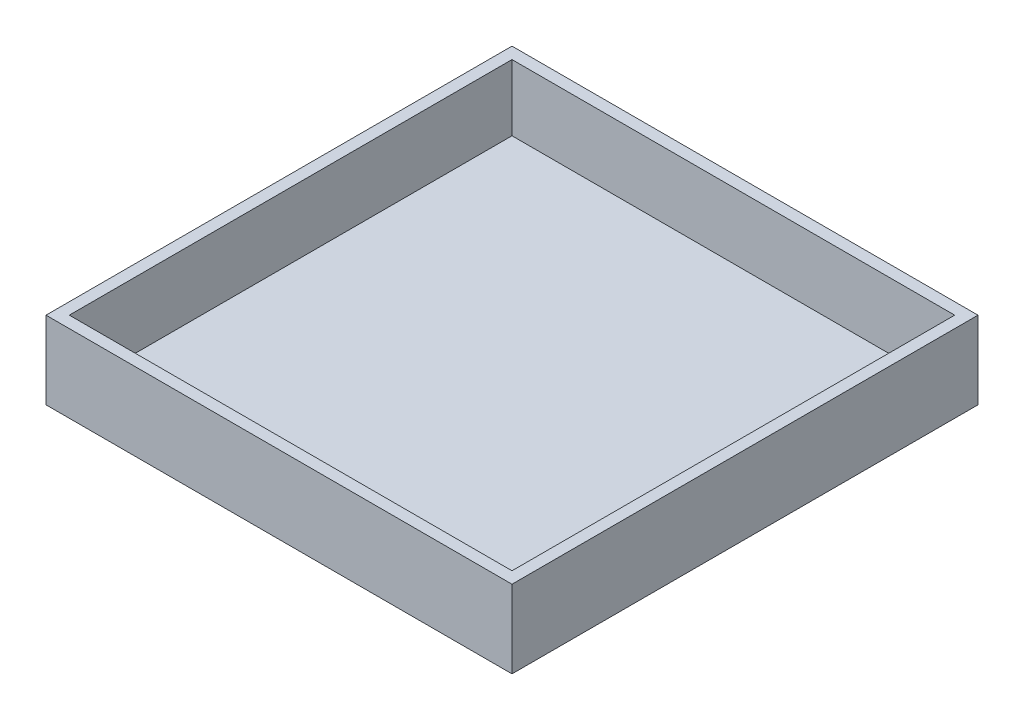
ISO-10303-21;
HEADER;
FILE_DESCRIPTION(('STEP AP214'),'2;1');
FILE_NAME('part.step','',(''),(''),'','','');
FILE_SCHEMA(('AUTOMOTIVE_DESIGN { 1 0 10303 214 1 1 1 1 }'));
ENDSEC;
DATA;
#1=APPLICATION_CONTEXT('core data for automotive mechanical design processes');
#2=APPLICATION_PROTOCOL_DEFINITION('international standard','automotive_design',2000,#1);
#3=PRODUCT_CONTEXT('',#1,'mechanical');
#4=PRODUCT('Part','Part','',(#3));
#5=PRODUCT_RELATED_PRODUCT_CATEGORY('part','',(#4));
#6=PRODUCT_DEFINITION_FORMATION('','',#4);
#7=PRODUCT_DEFINITION_CONTEXT('part definition',#1,'design');
#8=PRODUCT_DEFINITION('design','',#6,#7);
#9=PRODUCT_DEFINITION_SHAPE('','',#8);
#10=(LENGTH_UNIT() NAMED_UNIT(*) SI_UNIT(.MILLI.,.METRE.));
#11=(NAMED_UNIT(*) PLANE_ANGLE_UNIT() SI_UNIT($,.RADIAN.));
#12=(NAMED_UNIT(*) SI_UNIT($,.STERADIAN.) SOLID_ANGLE_UNIT());
#13=UNCERTAINTY_MEASURE_WITH_UNIT(LENGTH_MEASURE(1.E-05),#10,'distance_accuracy_value','');
#14=(GEOMETRIC_REPRESENTATION_CONTEXT(3) GLOBAL_UNCERTAINTY_ASSIGNED_CONTEXT((#13)) GLOBAL_UNIT_ASSIGNED_CONTEXT((#10,
#11,#12)) REPRESENTATION_CONTEXT('',''));
#15=CARTESIAN_POINT('',(0.,0.,0.));
#16=DIRECTION('',(0.,0.,1.));
#17=DIRECTION('',(1.,0.,0.));
#18=AXIS2_PLACEMENT_3D('',#15,#16,#17);
#19=CARTESIAN_POINT('',(3.,3.,3.));
#20=DIRECTION('',(0.,1.,0.));
#21=DIRECTION('',(1.,0.,0.));
#22=AXIS2_PLACEMENT_3D('',#19,#20,#21);
#23=PLANE('',#22);
#24=DIRECTION('',(1.,0.,0.));
#25=VECTOR('',#24,1.);
#26=CARTESIAN_POINT('',(3.,3.,3.));
#27=LINE('',#26,#25);
#28=CARTESIAN_POINT('',(3.,3.,3.));
#29=VERTEX_POINT('',#28);
#30=CARTESIAN_POINT('',(117.,3.,3.));
#31=VERTEX_POINT('',#30);
#32=EDGE_CURVE('E24',#29,#31,#27,.T.);
#33=ORIENTED_EDGE('',*,*,#32,.F.);
#34=DIRECTION('',(0.,0.,1.));
#35=VECTOR('',#34,1.);
#36=CARTESIAN_POINT('',(3.,3.,3.));
#37=LINE('',#36,#35);
#38=CARTESIAN_POINT('',(3.,3.,117.));
#39=VERTEX_POINT('',#38);
#40=EDGE_CURVE('E10',#29,#39,#37,.T.);
#41=ORIENTED_EDGE('',*,*,#40,.T.);
#42=DIRECTION('',(1.,0.,0.));
#43=VECTOR('',#42,1.);
#44=CARTESIAN_POINT('',(3.,3.,117.));
#45=LINE('',#44,#43);
#46=CARTESIAN_POINT('',(117.,3.,117.));
#47=VERTEX_POINT('',#46);
#48=EDGE_CURVE('E110',#39,#47,#45,.T.);
#49=ORIENTED_EDGE('',*,*,#48,.T.);
#50=DIRECTION('',(0.,0.,1.));
#51=VECTOR('',#50,1.);
#52=CARTESIAN_POINT('',(117.,3.,3.));
#53=LINE('',#52,#51);
#54=EDGE_CURVE('E150',#31,#47,#53,.T.);
#55=ORIENTED_EDGE('',*,*,#54,.F.);
#56=EDGE_LOOP('',(#33,#41,#49,#55));
#57=FACE_BOUND('',#56,.T.);
#58=ADVANCED_FACE('F16',(#57),#23,.T.);
#59=CARTESIAN_POINT('',(3.,3.,3.));
#60=DIRECTION('',(1.,0.,0.));
#61=DIRECTION('',(0.,1.,0.));
#62=AXIS2_PLACEMENT_3D('',#59,#60,#61);
#63=PLANE('',#62);
#64=DIRECTION('',(0.,1.,0.));
#65=VECTOR('',#64,1.);
#66=CARTESIAN_POINT('',(3.,3.,117.));
#67=LINE('',#66,#65);
#68=CARTESIAN_POINT('',(3.,20.,117.));
#69=VERTEX_POINT('',#68);
#70=EDGE_CURVE('E99',#39,#69,#67,.T.);
#71=ORIENTED_EDGE('',*,*,#70,.F.);
#72=ORIENTED_EDGE('',*,*,#40,.F.);
#73=DIRECTION('',(0.,1.,0.));
#74=VECTOR('',#73,1.);
#75=CARTESIAN_POINT('',(3.,3.,3.));
#76=LINE('',#75,#74);
#77=CARTESIAN_POINT('',(3.,20.,3.));
#78=VERTEX_POINT('',#77);
#79=EDGE_CURVE('E111',#29,#78,#76,.T.);
#80=ORIENTED_EDGE('',*,*,#79,.T.);
#81=DIRECTION('',(0.,0.,-1.));
#82=VECTOR('',#81,1.);
#83=CARTESIAN_POINT('',(3.,20.,1.5));
#84=LINE('',#83,#82);
#85=EDGE_CURVE('E115',#69,#78,#84,.T.);
#86=ORIENTED_EDGE('',*,*,#85,.F.);
#87=EDGE_LOOP('',(#71,#72,#80,#86));
#88=FACE_BOUND('',#87,.T.);
#89=ADVANCED_FACE('F114',(#88),#63,.T.);
#90=CARTESIAN_POINT('',(3.,3.,3.));
#91=DIRECTION('',(0.,0.,1.));
#92=DIRECTION('',(1.,0.,0.));
#93=AXIS2_PLACEMENT_3D('',#90,#91,#92);
#94=PLANE('',#93);
#95=ORIENTED_EDGE('',*,*,#79,.F.);
#96=ORIENTED_EDGE('',*,*,#32,.T.);
#97=DIRECTION('',(0.,1.,0.));
#98=VECTOR('',#97,1.);
#99=CARTESIAN_POINT('',(117.,3.,3.));
#100=LINE('',#99,#98);
#101=CARTESIAN_POINT('',(117.,20.,3.));
#102=VERTEX_POINT('',#101);
#103=EDGE_CURVE('E108',#31,#102,#100,.T.);
#104=ORIENTED_EDGE('',*,*,#103,.T.);
#105=DIRECTION('',(1.,0.,0.));
#106=VECTOR('',#105,1.);
#107=CARTESIAN_POINT('',(1.5,20.,3.));
#108=LINE('',#107,#106);
#109=EDGE_CURVE('E118',#78,#102,#108,.T.);
#110=ORIENTED_EDGE('',*,*,#109,.F.);
#111=EDGE_LOOP('',(#95,#96,#104,#110));
#112=FACE_BOUND('',#111,.T.);
#113=ADVANCED_FACE('F165',(#112),#94,.T.);
#114=CARTESIAN_POINT('',(117.,3.,3.));
#115=DIRECTION('',(1.,0.,0.));
#116=DIRECTION('',(0.,1.,0.));
#117=AXIS2_PLACEMENT_3D('',#114,#115,#116);
#118=PLANE('',#117);
#119=DIRECTION('',(0.,0.,-1.));
#120=VECTOR('',#119,1.);
#121=CARTESIAN_POINT('',(117.,20.,1.5));
#122=LINE('',#121,#120);
#123=CARTESIAN_POINT('',(117.,20.,117.));
#124=VERTEX_POINT('',#123);
#125=EDGE_CURVE('E124',#124,#102,#122,.T.);
#126=ORIENTED_EDGE('',*,*,#125,.T.);
#127=ORIENTED_EDGE('',*,*,#103,.F.);
#128=ORIENTED_EDGE('',*,*,#54,.T.);
#129=DIRECTION('',(0.,1.,0.));
#130=VECTOR('',#129,1.);
#131=CARTESIAN_POINT('',(117.,3.,117.));
#132=LINE('',#131,#130);
#133=EDGE_CURVE('E139',#47,#124,#132,.T.);
#134=ORIENTED_EDGE('',*,*,#133,.T.);
#135=EDGE_LOOP('',(#126,#127,#128,#134));
#136=FACE_BOUND('',#135,.T.);
#137=ADVANCED_FACE('F212',(#136),#118,.F.);
#138=CARTESIAN_POINT('',(3.,3.,117.));
#139=DIRECTION('',(0.,0.,1.));
#140=DIRECTION('',(1.,0.,0.));
#141=AXIS2_PLACEMENT_3D('',#138,#139,#140);
#142=PLANE('',#141);
#143=DIRECTION('',(1.,0.,0.));
#144=VECTOR('',#143,1.);
#145=CARTESIAN_POINT('',(1.5,20.,117.));
#146=LINE('',#145,#144);
#147=EDGE_CURVE('E104',#69,#124,#146,.T.);
#148=ORIENTED_EDGE('',*,*,#147,.T.);
#149=ORIENTED_EDGE('',*,*,#133,.F.);
#150=ORIENTED_EDGE('',*,*,#48,.F.);
#151=ORIENTED_EDGE('',*,*,#70,.T.);
#152=EDGE_LOOP('',(#148,#149,#150,#151));
#153=FACE_BOUND('',#152,.T.);
#154=ADVANCED_FACE('F105',(#153),#142,.F.);
#155=CARTESIAN_POINT('',(120.,0.,0.));
#156=DIRECTION('',(1.,0.,0.));
#157=DIRECTION('',(0.,1.,0.));
#158=AXIS2_PLACEMENT_3D('',#155,#156,#157);
#159=PLANE('',#158);
#160=DIRECTION('',(0.,0.,1.));
#161=VECTOR('',#160,1.);
#162=CARTESIAN_POINT('',(120.,0.,0.));
#163=LINE('',#162,#161);
#164=CARTESIAN_POINT('',(120.,0.,0.));
#165=VERTEX_POINT('',#164);
#166=CARTESIAN_POINT('',(120.,0.,120.));
#167=VERTEX_POINT('',#166);
#168=EDGE_CURVE('E264',#165,#167,#163,.T.);
#169=ORIENTED_EDGE('',*,*,#168,.F.);
#170=DIRECTION('',(0.,1.,0.));
#171=VECTOR('',#170,1.);
#172=CARTESIAN_POINT('',(120.,0.,0.));
#173=LINE('',#172,#171);
#174=CARTESIAN_POINT('',(120.,20.,0.));
#175=VERTEX_POINT('',#174);
#176=EDGE_CURVE('E137',#165,#175,#173,.T.);
#177=ORIENTED_EDGE('',*,*,#176,.T.);
#178=DIRECTION('',(0.,0.,1.));
#179=VECTOR('',#178,1.);
#180=CARTESIAN_POINT('',(120.,20.,0.));
#181=LINE('',#180,#179);
#182=CARTESIAN_POINT('',(120.,20.,120.));
#183=VERTEX_POINT('',#182);
#184=EDGE_CURVE('E126',#175,#183,#181,.T.);
#185=ORIENTED_EDGE('',*,*,#184,.T.);
#186=DIRECTION('',(0.,1.,0.));
#187=VECTOR('',#186,1.);
#188=CARTESIAN_POINT('',(120.,0.,120.));
#189=LINE('',#188,#187);
#190=EDGE_CURVE('E268',#167,#183,#189,.T.);
#191=ORIENTED_EDGE('',*,*,#190,.F.);
#192=EDGE_LOOP('',(#169,#177,#185,#191));
#193=FACE_BOUND('',#192,.T.);
#194=ADVANCED_FACE('F208',(#193),#159,.T.);
#195=CARTESIAN_POINT('',(0.,0.,0.));
#196=DIRECTION('',(0.,0.,1.));
#197=DIRECTION('',(1.,0.,0.));
#198=AXIS2_PLACEMENT_3D('',#195,#196,#197);
#199=PLANE('',#198);
#200=DIRECTION('',(1.,0.,0.));
#201=VECTOR('',#200,1.);
#202=CARTESIAN_POINT('',(0.,20.,0.));
#203=LINE('',#202,#201);
#204=CARTESIAN_POINT('',(0.,20.,0.));
#205=VERTEX_POINT('',#204);
#206=EDGE_CURVE('E131',#205,#175,#203,.T.);
#207=ORIENTED_EDGE('',*,*,#206,.T.);
#208=ORIENTED_EDGE('',*,*,#176,.F.);
#209=DIRECTION('',(1.,0.,0.));
#210=VECTOR('',#209,1.);
#211=CARTESIAN_POINT('',(0.,0.,0.));
#212=LINE('',#211,#210);
#213=CARTESIAN_POINT('',(0.,0.,0.));
#214=VERTEX_POINT('',#213);
#215=EDGE_CURVE('E279',#214,#165,#212,.T.);
#216=ORIENTED_EDGE('',*,*,#215,.F.);
#217=DIRECTION('',(0.,1.,0.));
#218=VECTOR('',#217,1.);
#219=CARTESIAN_POINT('',(0.,0.,0.));
#220=LINE('',#219,#218);
#221=EDGE_CURVE('E281',#214,#205,#220,.T.);
#222=ORIENTED_EDGE('',*,*,#221,.T.);
#223=EDGE_LOOP('',(#207,#208,#216,#222));
#224=FACE_BOUND('',#223,.T.);
#225=ADVANCED_FACE('F199',(#224),#199,.F.);
#226=CARTESIAN_POINT('',(0.,20.,0.));
#227=DIRECTION('',(0.,1.,0.));
#228=DIRECTION('',(1.,0.,0.));
#229=AXIS2_PLACEMENT_3D('',#226,#227,#228);
#230=PLANE('',#229);
#231=ORIENTED_EDGE('',*,*,#147,.F.);
#232=ORIENTED_EDGE('',*,*,#85,.T.);
#233=ORIENTED_EDGE('',*,*,#109,.T.);
#234=ORIENTED_EDGE('',*,*,#125,.F.);
#235=EDGE_LOOP('',(#231,#232,#233,#234));
#236=FACE_BOUND('',#235,.T.);
#237=ORIENTED_EDGE('',*,*,#206,.F.);
#238=DIRECTION('',(0.,0.,1.));
#239=VECTOR('',#238,1.);
#240=CARTESIAN_POINT('',(0.,20.,0.));
#241=LINE('',#240,#239);
#242=CARTESIAN_POINT('',(0.,20.,120.));
#243=VERTEX_POINT('',#242);
#244=EDGE_CURVE('E300',#205,#243,#241,.T.);
#245=ORIENTED_EDGE('',*,*,#244,.T.);
#246=DIRECTION('',(1.,0.,0.));
#247=VECTOR('',#246,1.);
#248=CARTESIAN_POINT('',(0.,20.,120.));
#249=LINE('',#248,#247);
#250=EDGE_CURVE('E290',#243,#183,#249,.T.);
#251=ORIENTED_EDGE('',*,*,#250,.T.);
#252=ORIENTED_EDGE('',*,*,#184,.F.);
#253=EDGE_LOOP('',(#237,#245,#251,#252));
#254=FACE_BOUND('',#253,.T.);
#255=ADVANCED_FACE('F125',(#236,#254),#230,.T.);
#256=CARTESIAN_POINT('',(0.,0.,120.));
#257=DIRECTION('',(0.,0.,1.));
#258=DIRECTION('',(1.,0.,0.));
#259=AXIS2_PLACEMENT_3D('',#256,#257,#258);
#260=PLANE('',#259);
#261=DIRECTION('',(0.,1.,0.));
#262=VECTOR('',#261,1.);
#263=CARTESIAN_POINT('',(0.,0.,120.));
#264=LINE('',#263,#262);
#265=CARTESIAN_POINT('',(0.,0.,120.));
#266=VERTEX_POINT('',#265);
#267=EDGE_CURVE('E299',#266,#243,#264,.T.);
#268=ORIENTED_EDGE('',*,*,#267,.F.);
#269=DIRECTION('',(1.,0.,0.));
#270=VECTOR('',#269,1.);
#271=CARTESIAN_POINT('',(0.,0.,120.));
#272=LINE('',#271,#270);
#273=EDGE_CURVE('E275',#266,#167,#272,.T.);
#274=ORIENTED_EDGE('',*,*,#273,.T.);
#275=ORIENTED_EDGE('',*,*,#190,.T.);
#276=ORIENTED_EDGE('',*,*,#250,.F.);
#277=EDGE_LOOP('',(#268,#274,#275,#276));
#278=FACE_BOUND('',#277,.T.);
#279=ADVANCED_FACE('F183',(#278),#260,.T.);
#280=CARTESIAN_POINT('',(0.,0.,0.));
#281=DIRECTION('',(0.,1.,0.));
#282=DIRECTION('',(1.,0.,0.));
#283=AXIS2_PLACEMENT_3D('',#280,#281,#282);
#284=PLANE('',#283);
#285=ORIENTED_EDGE('',*,*,#168,.T.);
#286=ORIENTED_EDGE('',*,*,#273,.F.);
#287=DIRECTION('',(0.,0.,1.));
#288=VECTOR('',#287,1.);
#289=CARTESIAN_POINT('',(0.,0.,0.));
#290=LINE('',#289,#288);
#291=EDGE_CURVE('E272',#214,#266,#290,.T.);
#292=ORIENTED_EDGE('',*,*,#291,.F.);
#293=ORIENTED_EDGE('',*,*,#215,.T.);
#294=EDGE_LOOP('',(#285,#286,#292,#293));
#295=FACE_BOUND('',#294,.T.);
#296=ADVANCED_FACE('F173',(#295),#284,.F.);
#297=CARTESIAN_POINT('',(0.,0.,0.));
#298=DIRECTION('',(1.,0.,0.));
#299=DIRECTION('',(0.,1.,0.));
#300=AXIS2_PLACEMENT_3D('',#297,#298,#299);
#301=PLANE('',#300);
#302=ORIENTED_EDGE('',*,*,#267,.T.);
#303=ORIENTED_EDGE('',*,*,#244,.F.);
#304=ORIENTED_EDGE('',*,*,#221,.F.);
#305=ORIENTED_EDGE('',*,*,#291,.T.);
#306=EDGE_LOOP('',(#302,#303,#304,#305));
#307=FACE_BOUND('',#306,.T.);
#308=ADVANCED_FACE('F166',(#307),#301,.F.);
#309=CLOSED_SHELL('',(#58,#89,#113,#137,#154,#194,#225,#255,#279,#296,#308));
#310=MANIFOLD_SOLID_BREP('B1',#309);
#311=ADVANCED_BREP_SHAPE_REPRESENTATION('',(#18,#310),#14);
#312=SHAPE_DEFINITION_REPRESENTATION(#9,#311);
ENDSEC;
END-ISO-10303-21;
